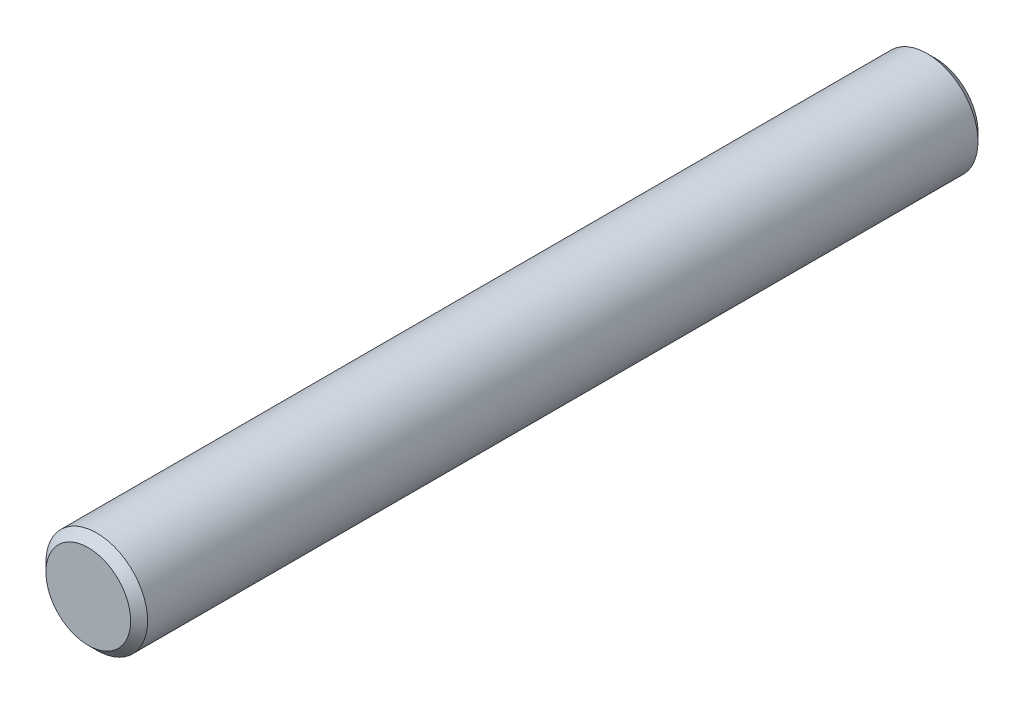
ISO-10303-21;
HEADER;
FILE_DESCRIPTION(('STEP AP214'),'2;1');
FILE_NAME('part.step','',(''),(''),'','','');
FILE_SCHEMA(('AUTOMOTIVE_DESIGN { 1 0 10303 214 1 1 1 1 }'));
ENDSEC;
DATA;
#1=APPLICATION_CONTEXT('core data for automotive mechanical design processes');
#2=APPLICATION_PROTOCOL_DEFINITION('international standard','automotive_design',2000,#1);
#3=PRODUCT_CONTEXT('',#1,'mechanical');
#4=PRODUCT('Part','Part','',(#3));
#5=PRODUCT_RELATED_PRODUCT_CATEGORY('part','',(#4));
#6=PRODUCT_DEFINITION_FORMATION('','',#4);
#7=PRODUCT_DEFINITION_CONTEXT('part definition',#1,'design');
#8=PRODUCT_DEFINITION('design','',#6,#7);
#9=PRODUCT_DEFINITION_SHAPE('','',#8);
#10=(LENGTH_UNIT() NAMED_UNIT(*) SI_UNIT(.MILLI.,.METRE.));
#11=(NAMED_UNIT(*) PLANE_ANGLE_UNIT() SI_UNIT($,.RADIAN.));
#12=(NAMED_UNIT(*) SI_UNIT($,.STERADIAN.) SOLID_ANGLE_UNIT());
#13=UNCERTAINTY_MEASURE_WITH_UNIT(LENGTH_MEASURE(1.E-05),#10,'distance_accuracy_value','');
#14=(GEOMETRIC_REPRESENTATION_CONTEXT(3) GLOBAL_UNCERTAINTY_ASSIGNED_CONTEXT((#13)) GLOBAL_UNIT_ASSIGNED_CONTEXT((#10,
#11,#12)) REPRESENTATION_CONTEXT('',''));
#15=CARTESIAN_POINT('',(0.,0.,0.));
#16=DIRECTION('',(0.,0.,1.));
#17=DIRECTION('',(1.,0.,0.));
#18=AXIS2_PLACEMENT_3D('',#15,#16,#17);
#19=CARTESIAN_POINT('',(0.,0.,12.5));
#20=DIRECTION('',(0.,0.,-1.));
#21=DIRECTION('',(-1.,0.,0.));
#22=AXIS2_PLACEMENT_3D('',#19,#20,#21);
#23=CYLINDRICAL_SURFACE('',#22,1.5);
#24=CARTESIAN_POINT('',(0.,0.,-12.25));
#25=DIRECTION('',(0.,0.,1.));
#26=DIRECTION('',(1.,0.,0.));
#27=AXIS2_PLACEMENT_3D('',#24,#25,#26);
#28=CIRCLE('',#27,1.5);
#29=CARTESIAN_POINT('',(1.5,0.,-12.25));
#30=VERTEX_POINT('',#29);
#31=EDGE_CURVE('E45',#30,#30,#28,.T.);
#32=ORIENTED_EDGE('',*,*,#31,.T.);
#33=EDGE_LOOP('',(#32));
#34=FACE_BOUND('',#33,.T.);
#35=CARTESIAN_POINT('',(0.,0.,12.25));
#36=DIRECTION('',(0.,0.,1.));
#37=DIRECTION('',(1.,0.,0.));
#38=AXIS2_PLACEMENT_3D('',#35,#36,#37);
#39=CIRCLE('',#38,1.5);
#40=CARTESIAN_POINT('',(1.5,0.,12.25));
#41=VERTEX_POINT('',#40);
#42=EDGE_CURVE('E49',#41,#41,#39,.F.);
#43=ORIENTED_EDGE('',*,*,#42,.T.);
#44=EDGE_LOOP('',(#43));
#45=FACE_BOUND('',#44,.T.);
#46=ADVANCED_FACE('F33',(#34,#45),#23,.T.);
#47=CARTESIAN_POINT('',(0.,0.,12.5));
#48=DIRECTION('',(0.,0.,1.));
#49=DIRECTION('',(1.,0.,0.));
#50=AXIS2_PLACEMENT_3D('',#47,#48,#49);
#51=PLANE('',#50);
#52=CARTESIAN_POINT('',(0.,0.,12.5));
#53=DIRECTION('',(0.,0.,1.));
#54=DIRECTION('',(1.,0.,0.));
#55=AXIS2_PLACEMENT_3D('',#52,#53,#54);
#56=CIRCLE('',#55,1.25);
#57=CARTESIAN_POINT('',(1.25,0.,12.5));
#58=VERTEX_POINT('',#57);
#59=EDGE_CURVE('E10',#58,#58,#56,.T.);
#60=ORIENTED_EDGE('',*,*,#59,.T.);
#61=EDGE_LOOP('',(#60));
#62=FACE_BOUND('',#61,.T.);
#63=ADVANCED_FACE('F65',(#62),#51,.T.);
#64=CARTESIAN_POINT('',(0.,0.,-12.5));
#65=DIRECTION('',(0.,0.,1.));
#66=DIRECTION('',(1.,0.,0.));
#67=AXIS2_PLACEMENT_3D('',#64,#65,#66);
#68=PLANE('',#67);
#69=CARTESIAN_POINT('',(0.,0.,-12.5));
#70=DIRECTION('',(0.,0.,1.));
#71=DIRECTION('',(1.,0.,0.));
#72=AXIS2_PLACEMENT_3D('',#69,#70,#71);
#73=CIRCLE('',#72,1.25);
#74=CARTESIAN_POINT('',(1.25,0.,-12.5));
#75=VERTEX_POINT('',#74);
#76=EDGE_CURVE('E41',#75,#75,#73,.F.);
#77=ORIENTED_EDGE('',*,*,#76,.T.);
#78=EDGE_LOOP('',(#77));
#79=FACE_BOUND('',#78,.T.);
#80=ADVANCED_FACE('F62',(#79),#68,.F.);
#81=CARTESIAN_POINT('',(0.,0.,-12.25));
#82=DIRECTION('',(0.,0.,1.));
#83=DIRECTION('',(1.,0.,0.));
#84=AXIS2_PLACEMENT_3D('',#81,#82,#83);
#85=CONICAL_SURFACE('',#84,1.5,0.785398163397453);
#86=ORIENTED_EDGE('',*,*,#76,.F.);
#87=EDGE_LOOP('',(#86));
#88=FACE_BOUND('',#87,.T.);
#89=ORIENTED_EDGE('',*,*,#31,.F.);
#90=EDGE_LOOP('',(#89));
#91=FACE_BOUND('',#90,.T.);
#92=ADVANCED_FACE('F58',(#88,#91),#85,.T.);
#93=CARTESIAN_POINT('',(0.,0.,12.5));
#94=DIRECTION('',(0.,0.,-1.));
#95=DIRECTION('',(-1.,0.,0.));
#96=AXIS2_PLACEMENT_3D('',#93,#94,#95);
#97=CONICAL_SURFACE('',#96,1.25,0.785398163397446);
#98=ORIENTED_EDGE('',*,*,#42,.F.);
#99=EDGE_LOOP('',(#98));
#100=FACE_BOUND('',#99,.T.);
#101=ORIENTED_EDGE('',*,*,#59,.F.);
#102=EDGE_LOOP('',(#101));
#103=FACE_BOUND('',#102,.T.);
#104=ADVANCED_FACE('F36',(#100,#103),#97,.T.);
#105=CLOSED_SHELL('',(#46,#63,#80,#92,#104));
#106=MANIFOLD_SOLID_BREP('B2',#105);
#107=ADVANCED_BREP_SHAPE_REPRESENTATION('',(#18,#106),#14);
#108=SHAPE_DEFINITION_REPRESENTATION(#9,#107);
ENDSEC;
END-ISO-10303-21;
